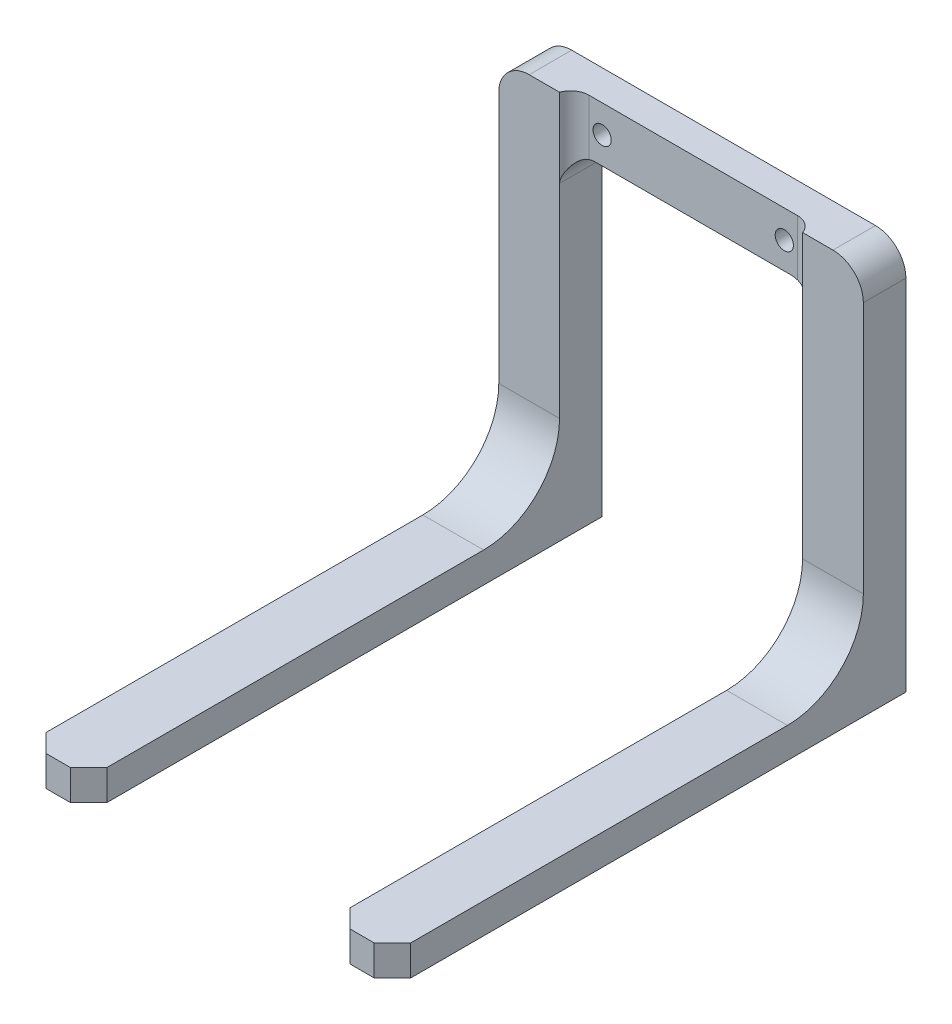
ISO-10303-21;
HEADER;
FILE_DESCRIPTION(('STEP AP214'),'2;1');
FILE_NAME('part.step','',(''),(''),'','','');
FILE_SCHEMA(('AUTOMOTIVE_DESIGN { 1 0 10303 214 1 1 1 1 }'));
ENDSEC;
DATA;
#1=APPLICATION_CONTEXT('core data for automotive mechanical design processes');
#2=APPLICATION_PROTOCOL_DEFINITION('international standard','automotive_design',2000,#1);
#3=PRODUCT_CONTEXT('',#1,'mechanical');
#4=PRODUCT('Part','Part','',(#3));
#5=PRODUCT_RELATED_PRODUCT_CATEGORY('part','',(#4));
#6=PRODUCT_DEFINITION_FORMATION('','',#4);
#7=PRODUCT_DEFINITION_CONTEXT('part definition',#1,'design');
#8=PRODUCT_DEFINITION('design','',#6,#7);
#9=PRODUCT_DEFINITION_SHAPE('','',#8);
#10=(LENGTH_UNIT() NAMED_UNIT(*) SI_UNIT(.MILLI.,.METRE.));
#11=(NAMED_UNIT(*) PLANE_ANGLE_UNIT() SI_UNIT($,.RADIAN.));
#12=(NAMED_UNIT(*) SI_UNIT($,.STERADIAN.) SOLID_ANGLE_UNIT());
#13=UNCERTAINTY_MEASURE_WITH_UNIT(LENGTH_MEASURE(1.E-05),#10,'distance_accuracy_value','');
#14=(GEOMETRIC_REPRESENTATION_CONTEXT(3) GLOBAL_UNCERTAINTY_ASSIGNED_CONTEXT((#13)) GLOBAL_UNIT_ASSIGNED_CONTEXT((#10,
#11,#12)) REPRESENTATION_CONTEXT('',''));
#15=CARTESIAN_POINT('',(0.,0.,0.));
#16=DIRECTION('',(0.,0.,1.));
#17=DIRECTION('',(1.,0.,0.));
#18=AXIS2_PLACEMENT_3D('',#15,#16,#17);
#19=CARTESIAN_POINT('',(-30.,9.,3.5));
#20=DIRECTION('',(0.,0.,-1.));
#21=DIRECTION('',(-1.,0.,0.));
#22=AXIS2_PLACEMENT_3D('',#19,#20,#21);
#23=PLANE('',#22);
#24=DIRECTION('',(0.,1.,0.));
#25=VECTOR('',#24,1.);
#26=CARTESIAN_POINT('',(20.,-55.,3.5));
#27=LINE('',#26,#25);
#28=CARTESIAN_POINT('',(20.,-37.5,3.5));
#29=VERTEX_POINT('',#28);
#30=CARTESIAN_POINT('',(20.,-4.,3.5));
#31=VERTEX_POINT('',#30);
#32=EDGE_CURVE('E245',#29,#31,#27,.T.);
#33=ORIENTED_EDGE('',*,*,#32,.F.);
#34=DIRECTION('',(-1.,0.,0.));
#35=VECTOR('',#34,1.);
#36=CARTESIAN_POINT('',(30.,-37.5,3.5));
#37=LINE('',#36,#35);
#38=CARTESIAN_POINT('',(30.,-37.5,3.5));
#39=VERTEX_POINT('',#38);
#40=EDGE_CURVE('E548',#29,#39,#37,.F.);
#41=ORIENTED_EDGE('',*,*,#40,.T.);
#42=DIRECTION('',(0.,-1.,0.));
#43=VECTOR('',#42,1.);
#44=CARTESIAN_POINT('',(30.,9.,3.5));
#45=LINE('',#44,#43);
#46=CARTESIAN_POINT('',(30.,4.,3.5));
#47=VERTEX_POINT('',#46);
#48=EDGE_CURVE('E279',#47,#39,#45,.T.);
#49=ORIENTED_EDGE('',*,*,#48,.F.);
#50=CARTESIAN_POINT('',(25.,4.,3.5));
#51=DIRECTION('',(0.,0.,-1.));
#52=DIRECTION('',(-1.,0.,0.));
#53=AXIS2_PLACEMENT_3D('',#50,#51,#52);
#54=CIRCLE('',#53,5.);
#55=CARTESIAN_POINT('',(25.,9.,3.5));
#56=VERTEX_POINT('',#55);
#57=EDGE_CURVE('E312',#47,#56,#54,.F.);
#58=ORIENTED_EDGE('',*,*,#57,.T.);
#59=DIRECTION('',(1.,0.,0.));
#60=VECTOR('',#59,1.);
#61=CARTESIAN_POINT('',(-30.,9.,3.5));
#62=LINE('',#61,#60);
#63=CARTESIAN_POINT('',(20.,9.,3.5));
#64=VERTEX_POINT('',#63);
#65=EDGE_CURVE('E276',#64,#56,#62,.T.);
#66=ORIENTED_EDGE('',*,*,#65,.F.);
#67=DIRECTION('',(0.,1.,0.));
#68=VECTOR('',#67,1.);
#69=CARTESIAN_POINT('',(20.,9.,3.5));
#70=LINE('',#69,#68);
#71=EDGE_CURVE('E265',#31,#64,#70,.T.);
#72=ORIENTED_EDGE('',*,*,#71,.F.);
#73=EDGE_LOOP('',(#33,#41,#49,#58,#66,#72));
#74=FACE_BOUND('',#73,.T.);
#75=ADVANCED_FACE('F48',(#74),#23,.F.);
#76=DIRECTION('',(0.,-1.,0.));
#77=VECTOR('',#76,1.);
#78=CARTESIAN_POINT('',(-30.,9.,3.5));
#79=LINE('',#78,#77);
#80=CARTESIAN_POINT('',(-30.,4.,3.5));
#81=VERTEX_POINT('',#80);
#82=CARTESIAN_POINT('',(-30.,-37.5,3.5));
#83=VERTEX_POINT('',#82);
#84=EDGE_CURVE('E284',#81,#83,#79,.T.);
#85=ORIENTED_EDGE('',*,*,#84,.T.);
#86=DIRECTION('',(-1.,0.,0.));
#87=VECTOR('',#86,1.);
#88=CARTESIAN_POINT('',(-20.,-37.5,3.5));
#89=LINE('',#88,#87);
#90=CARTESIAN_POINT('',(-20.,-37.5,3.5));
#91=VERTEX_POINT('',#90);
#92=EDGE_CURVE('E453',#83,#91,#89,.F.);
#93=ORIENTED_EDGE('',*,*,#92,.T.);
#94=DIRECTION('',(0.,1.,0.));
#95=VECTOR('',#94,1.);
#96=CARTESIAN_POINT('',(-20.,-55.,3.5));
#97=LINE('',#96,#95);
#98=CARTESIAN_POINT('',(-20.,-4.,3.5));
#99=VERTEX_POINT('',#98);
#100=EDGE_CURVE('E258',#91,#99,#97,.T.);
#101=ORIENTED_EDGE('',*,*,#100,.T.);
#102=DIRECTION('',(0.,-1.,0.));
#103=VECTOR('',#102,1.);
#104=CARTESIAN_POINT('',(-20.,9.,3.5));
#105=LINE('',#104,#103);
#106=CARTESIAN_POINT('',(-20.,9.,3.5));
#107=VERTEX_POINT('',#106);
#108=EDGE_CURVE('E260',#107,#99,#105,.T.);
#109=ORIENTED_EDGE('',*,*,#108,.F.);
#110=CARTESIAN_POINT('',(-25.,9.,3.5));
#111=VERTEX_POINT('',#110);
#112=EDGE_CURVE('E277',#111,#107,#62,.T.);
#113=ORIENTED_EDGE('',*,*,#112,.F.);
#114=CARTESIAN_POINT('',(-25.,4.,3.5));
#115=DIRECTION('',(0.,0.,-1.));
#116=DIRECTION('',(-1.,0.,0.));
#117=AXIS2_PLACEMENT_3D('',#114,#115,#116);
#118=CIRCLE('',#117,5.);
#119=EDGE_CURVE('E314',#111,#81,#118,.F.);
#120=ORIENTED_EDGE('',*,*,#119,.T.);
#121=EDGE_LOOP('',(#85,#93,#101,#109,#113,#120));
#122=FACE_BOUND('',#121,.T.);
#123=ADVANCED_FACE('F389',(#122),#23,.F.);
#124=CARTESIAN_POINT('',(0.,0.,0.));
#125=DIRECTION('',(0.,1.,0.));
#126=DIRECTION('',(0.,0.,1.));
#127=AXIS2_PLACEMENT_3D('',#124,#125,#126);
#128=PLANE('',#127);
#129=DIRECTION('',(-1.,0.,0.));
#130=VECTOR('',#129,1.);
#131=CARTESIAN_POINT('',(-30.,0.,-3.5));
#132=LINE('',#131,#130);
#133=CARTESIAN_POINT('',(16.,0.,-3.5));
#134=VERTEX_POINT('',#133);
#135=CARTESIAN_POINT('',(-16.,0.,-3.5));
#136=VERTEX_POINT('',#135);
#137=EDGE_CURVE('E268',#134,#136,#132,.T.);
#138=ORIENTED_EDGE('',*,*,#137,.F.);
#139=DIRECTION('',(0.,0.,-1.));
#140=VECTOR('',#139,1.);
#141=CARTESIAN_POINT('',(16.,0.,3.5));
#142=LINE('',#141,#140);
#143=CARTESIAN_POINT('',(16.,0.,1.5));
#144=VERTEX_POINT('',#143);
#145=EDGE_CURVE('E321',#134,#144,#142,.F.);
#146=ORIENTED_EDGE('',*,*,#145,.T.);
#147=DIRECTION('',(1.,0.,0.));
#148=VECTOR('',#147,1.);
#149=CARTESIAN_POINT('',(-20.,0.,1.5));
#150=LINE('',#149,#148);
#151=CARTESIAN_POINT('',(-16.,0.,1.5));
#152=VERTEX_POINT('',#151);
#153=EDGE_CURVE('E261',#152,#144,#150,.T.);
#154=ORIENTED_EDGE('',*,*,#153,.F.);
#155=DIRECTION('',(0.,0.,1.));
#156=VECTOR('',#155,1.);
#157=CARTESIAN_POINT('',(-16.,0.,-3.5));
#158=LINE('',#157,#156);
#159=EDGE_CURVE('E319',#152,#136,#158,.F.);
#160=ORIENTED_EDGE('',*,*,#159,.T.);
#161=EDGE_LOOP('',(#138,#146,#154,#160));
#162=FACE_BOUND('',#161,.T.);
#163=ADVANCED_FACE('F395',(#162),#128,.F.);
#164=CARTESIAN_POINT('',(30.,9.,-3.5));
#165=DIRECTION('',(-1.,0.,0.));
#166=DIRECTION('',(0.,0.,1.));
#167=AXIS2_PLACEMENT_3D('',#164,#165,#166);
#168=PLANE('',#167);
#169=DIRECTION('',(0.,0.,-1.));
#170=VECTOR('',#169,1.);
#171=CARTESIAN_POINT('',(30.,-50.,81.));
#172=LINE('',#171,#170);
#173=CARTESIAN_POINT('',(30.,-50.,78.));
#174=VERTEX_POINT('',#173);
#175=CARTESIAN_POINT('',(30.,-50.,16.));
#176=VERTEX_POINT('',#175);
#177=EDGE_CURVE('E520',#174,#176,#172,.T.);
#178=ORIENTED_EDGE('',*,*,#177,.F.);
#179=DIRECTION('',(0.,-1.,0.));
#180=VECTOR('',#179,1.);
#181=CARTESIAN_POINT('',(30.,9.,78.));
#182=LINE('',#181,#180);
#183=CARTESIAN_POINT('',(30.,-55.,78.));
#184=VERTEX_POINT('',#183);
#185=EDGE_CURVE('E479',#174,#184,#182,.T.);
#186=ORIENTED_EDGE('',*,*,#185,.T.);
#187=DIRECTION('',(0.,0.,1.));
#188=VECTOR('',#187,1.);
#189=CARTESIAN_POINT('',(30.,-55.,3.5));
#190=LINE('',#189,#188);
#191=CARTESIAN_POINT('',(30.,-55.,-3.5));
#192=VERTEX_POINT('',#191);
#193=EDGE_CURVE('E238',#192,#184,#190,.T.);
#194=ORIENTED_EDGE('',*,*,#193,.F.);
#195=DIRECTION('',(0.,-1.,0.));
#196=VECTOR('',#195,1.);
#197=CARTESIAN_POINT('',(30.,9.,-3.5));
#198=LINE('',#197,#196);
#199=CARTESIAN_POINT('',(30.,4.,-3.5));
#200=VERTEX_POINT('',#199);
#201=EDGE_CURVE('E237',#200,#192,#198,.T.);
#202=ORIENTED_EDGE('',*,*,#201,.F.);
#203=DIRECTION('',(0.,0.,-1.));
#204=VECTOR('',#203,1.);
#205=CARTESIAN_POINT('',(30.,4.,3.5));
#206=LINE('',#205,#204);
#207=EDGE_CURVE('E310',#200,#47,#206,.F.);
#208=ORIENTED_EDGE('',*,*,#207,.T.);
#209=ORIENTED_EDGE('',*,*,#48,.T.);
#210=CARTESIAN_POINT('',(30.,-37.5,16.));
#211=DIRECTION('',(-1.,0.,0.));
#212=DIRECTION('',(0.,0.,1.));
#213=AXIS2_PLACEMENT_3D('',#210,#211,#212);
#214=CIRCLE('',#213,12.5);
#215=EDGE_CURVE('E469',#39,#176,#214,.T.);
#216=ORIENTED_EDGE('',*,*,#215,.T.);
#217=EDGE_LOOP('',(#178,#186,#194,#202,#208,#209,#216));
#218=FACE_BOUND('',#217,.T.);
#219=ADVANCED_FACE('F408',(#218),#168,.F.);
#220=CARTESIAN_POINT('',(-30.,9.,-3.5));
#221=DIRECTION('',(0.,0.,1.));
#222=DIRECTION('',(1.,0.,0.));
#223=AXIS2_PLACEMENT_3D('',#220,#221,#222);
#224=PLANE('',#223);
#225=CARTESIAN_POINT('',(14.9914863383138,4.41229031516984,-3.5));
#226=DIRECTION('',(0.,0.,-1.));
#227=DIRECTION('',(-1.,0.,0.));
#228=AXIS2_PLACEMENT_3D('',#225,#226,#227);
#229=CIRCLE('',#228,1.5);
#230=CARTESIAN_POINT('',(13.4914863383138,4.41229031516984,-3.5));
#231=VERTEX_POINT('',#230);
#232=EDGE_CURVE('E500',#231,#231,#229,.T.);
#233=ORIENTED_EDGE('',*,*,#232,.F.);
#234=EDGE_LOOP('',(#233));
#235=FACE_BOUND('',#234,.T.);
#236=CARTESIAN_POINT('',(-14.9914863383138,4.41229031516984,-3.5));
#237=DIRECTION('',(0.,0.,-1.));
#238=DIRECTION('',(-1.,0.,0.));
#239=AXIS2_PLACEMENT_3D('',#236,#237,#238);
#240=CIRCLE('',#239,1.5);
#241=CARTESIAN_POINT('',(-16.4914863383138,4.41229031516984,-3.5));
#242=VERTEX_POINT('',#241);
#243=EDGE_CURVE('E506',#242,#242,#240,.T.);
#244=ORIENTED_EDGE('',*,*,#243,.F.);
#245=EDGE_LOOP('',(#244));
#246=FACE_BOUND('',#245,.T.);
#247=DIRECTION('',(-1.,0.,0.));
#248=VECTOR('',#247,1.);
#249=CARTESIAN_POINT('',(-30.,9.,-3.5));
#250=LINE('',#249,#248);
#251=CARTESIAN_POINT('',(25.,9.,-3.5));
#252=VERTEX_POINT('',#251);
#253=CARTESIAN_POINT('',(-25.,9.,-3.5));
#254=VERTEX_POINT('',#253);
#255=EDGE_CURVE('E273',#252,#254,#250,.T.);
#256=ORIENTED_EDGE('',*,*,#255,.F.);
#257=CARTESIAN_POINT('',(25.,4.,-3.5));
#258=DIRECTION('',(0.,0.,1.));
#259=DIRECTION('',(1.,0.,0.));
#260=AXIS2_PLACEMENT_3D('',#257,#258,#259);
#261=CIRCLE('',#260,5.);
#262=EDGE_CURVE('E308',#252,#200,#261,.F.);
#263=ORIENTED_EDGE('',*,*,#262,.T.);
#264=ORIENTED_EDGE('',*,*,#201,.T.);
#265=DIRECTION('',(1.,0.,0.));
#266=VECTOR('',#265,1.);
#267=CARTESIAN_POINT('',(20.,-55.,-3.5));
#268=LINE('',#267,#266);
#269=CARTESIAN_POINT('',(20.,-55.,-3.5));
#270=VERTEX_POINT('',#269);
#271=EDGE_CURVE('E222',#270,#192,#268,.T.);
#272=ORIENTED_EDGE('',*,*,#271,.F.);
#273=DIRECTION('',(0.,1.,0.));
#274=VECTOR('',#273,1.);
#275=CARTESIAN_POINT('',(20.,-55.,-3.5));
#276=LINE('',#275,#274);
#277=CARTESIAN_POINT('',(20.,-4.,-3.5));
#278=VERTEX_POINT('',#277);
#279=EDGE_CURVE('E235',#270,#278,#276,.T.);
#280=ORIENTED_EDGE('',*,*,#279,.T.);
#281=CARTESIAN_POINT('',(16.,-4.,-3.5));
#282=DIRECTION('',(0.,0.,1.));
#283=DIRECTION('',(1.,0.,0.));
#284=AXIS2_PLACEMENT_3D('',#281,#282,#283);
#285=CIRCLE('',#284,4.);
#286=EDGE_CURVE('E326',#278,#134,#285,.T.);
#287=ORIENTED_EDGE('',*,*,#286,.T.);
#288=ORIENTED_EDGE('',*,*,#137,.T.);
#289=CARTESIAN_POINT('',(-16.,-4.,-3.5));
#290=DIRECTION('',(0.,0.,1.));
#291=DIRECTION('',(1.,0.,0.));
#292=AXIS2_PLACEMENT_3D('',#289,#290,#291);
#293=CIRCLE('',#292,4.);
#294=CARTESIAN_POINT('',(-20.,-4.,-3.5));
#295=VERTEX_POINT('',#294);
#296=EDGE_CURVE('E551',#136,#295,#293,.T.);
#297=ORIENTED_EDGE('',*,*,#296,.T.);
#298=DIRECTION('',(0.,1.,0.));
#299=VECTOR('',#298,1.);
#300=CARTESIAN_POINT('',(-20.,-55.,-3.5));
#301=LINE('',#300,#299);
#302=CARTESIAN_POINT('',(-20.,-55.,-3.5));
#303=VERTEX_POINT('',#302);
#304=EDGE_CURVE('E255',#303,#295,#301,.T.);
#305=ORIENTED_EDGE('',*,*,#304,.F.);
#306=DIRECTION('',(1.,0.,0.));
#307=VECTOR('',#306,1.);
#308=CARTESIAN_POINT('',(-20.,-55.,-3.5));
#309=LINE('',#308,#307);
#310=CARTESIAN_POINT('',(-30.,-55.,-3.5));
#311=VERTEX_POINT('',#310);
#312=EDGE_CURVE('E253',#311,#303,#309,.T.);
#313=ORIENTED_EDGE('',*,*,#312,.F.);
#314=DIRECTION('',(0.,-1.,0.));
#315=VECTOR('',#314,1.);
#316=CARTESIAN_POINT('',(-30.,9.,-3.5));
#317=LINE('',#316,#315);
#318=CARTESIAN_POINT('',(-30.,4.,-3.5));
#319=VERTEX_POINT('',#318);
#320=EDGE_CURVE('E287',#319,#311,#317,.T.);
#321=ORIENTED_EDGE('',*,*,#320,.F.);
#322=CARTESIAN_POINT('',(-25.,4.,-3.5));
#323=DIRECTION('',(0.,0.,1.));
#324=DIRECTION('',(1.,0.,0.));
#325=AXIS2_PLACEMENT_3D('',#322,#323,#324);
#326=CIRCLE('',#325,5.);
#327=EDGE_CURVE('E306',#319,#254,#326,.F.);
#328=ORIENTED_EDGE('',*,*,#327,.T.);
#329=EDGE_LOOP('',(#256,#263,#264,#272,#280,#287,#288,#297,#305,#313,#321,#328));
#330=FACE_BOUND('',#329,.T.);
#331=ADVANCED_FACE('F234',(#235,#246,#330),#224,.F.);
#332=CARTESIAN_POINT('',(-30.,9.,-3.5));
#333=DIRECTION('',(1.,0.,0.));
#334=DIRECTION('',(0.,0.,-1.));
#335=AXIS2_PLACEMENT_3D('',#332,#333,#334);
#336=PLANE('',#335);
#337=DIRECTION('',(0.,0.,-1.));
#338=VECTOR('',#337,1.);
#339=CARTESIAN_POINT('',(-30.,-55.,3.5));
#340=LINE('',#339,#338);
#341=CARTESIAN_POINT('',(-30.,-55.,78.));
#342=VERTEX_POINT('',#341);
#343=EDGE_CURVE('E247',#342,#311,#340,.T.);
#344=ORIENTED_EDGE('',*,*,#343,.F.);
#345=DIRECTION('',(0.,1.,0.));
#346=VECTOR('',#345,1.);
#347=CARTESIAN_POINT('',(-30.,9.,78.));
#348=LINE('',#347,#346);
#349=CARTESIAN_POINT('',(-30.,-50.,78.));
#350=VERTEX_POINT('',#349);
#351=EDGE_CURVE('E13',#342,#350,#348,.T.);
#352=ORIENTED_EDGE('',*,*,#351,.T.);
#353=DIRECTION('',(0.,0.,-1.));
#354=VECTOR('',#353,1.);
#355=CARTESIAN_POINT('',(-30.,-50.,81.));
#356=LINE('',#355,#354);
#357=CARTESIAN_POINT('',(-30.,-50.,16.));
#358=VERTEX_POINT('',#357);
#359=EDGE_CURVE('E528',#350,#358,#356,.T.);
#360=ORIENTED_EDGE('',*,*,#359,.T.);
#361=CARTESIAN_POINT('',(-30.,-37.5,16.));
#362=DIRECTION('',(1.,0.,0.));
#363=DIRECTION('',(0.,0.,-1.));
#364=AXIS2_PLACEMENT_3D('',#361,#362,#363);
#365=CIRCLE('',#364,12.5);
#366=EDGE_CURVE('E464',#358,#83,#365,.T.);
#367=ORIENTED_EDGE('',*,*,#366,.T.);
#368=ORIENTED_EDGE('',*,*,#84,.F.);
#369=DIRECTION('',(0.,0.,1.));
#370=VECTOR('',#369,1.);
#371=CARTESIAN_POINT('',(-30.,4.,-3.5));
#372=LINE('',#371,#370);
#373=EDGE_CURVE('E316',#81,#319,#372,.F.);
#374=ORIENTED_EDGE('',*,*,#373,.T.);
#375=ORIENTED_EDGE('',*,*,#320,.T.);
#376=EDGE_LOOP('',(#344,#352,#360,#367,#368,#374,#375));
#377=FACE_BOUND('',#376,.T.);
#378=ADVANCED_FACE('F401',(#377),#336,.F.);
#379=CARTESIAN_POINT('',(0.,9.,0.));
#380=DIRECTION('',(0.,1.,0.));
#381=DIRECTION('',(0.,0.,1.));
#382=AXIS2_PLACEMENT_3D('',#379,#380,#381);
#383=PLANE('',#382);
#384=ORIENTED_EDGE('',*,*,#65,.T.);
#385=DIRECTION('',(0.,0.,-1.));
#386=VECTOR('',#385,1.);
#387=CARTESIAN_POINT('',(25.,9.,-3.5));
#388=LINE('',#387,#386);
#389=EDGE_CURVE('E303',#56,#252,#388,.T.);
#390=ORIENTED_EDGE('',*,*,#389,.T.);
#391=ORIENTED_EDGE('',*,*,#255,.T.);
#392=DIRECTION('',(0.,0.,1.));
#393=VECTOR('',#392,1.);
#394=CARTESIAN_POINT('',(-25.,9.,3.5));
#395=LINE('',#394,#393);
#396=EDGE_CURVE('E300',#254,#111,#395,.T.);
#397=ORIENTED_EDGE('',*,*,#396,.T.);
#398=ORIENTED_EDGE('',*,*,#112,.T.);
#399=CARTESIAN_POINT('',(-17.1715728752538,9.,4.5));
#400=DIRECTION('',(0.,1.,0.));
#401=DIRECTION('',(0.,0.,1.));
#402=AXIS2_PLACEMENT_3D('',#399,#400,#401);
#403=CIRCLE('',#402,3.);
#404=CARTESIAN_POINT('',(-17.1715728752538,9.,1.5));
#405=VERTEX_POINT('',#404);
#406=EDGE_CURVE('E296',#107,#405,#403,.F.);
#407=ORIENTED_EDGE('',*,*,#406,.T.);
#408=DIRECTION('',(-1.,0.,0.));
#409=VECTOR('',#408,1.);
#410=CARTESIAN_POINT('',(-20.,9.,1.5));
#411=LINE('',#410,#409);
#412=CARTESIAN_POINT('',(17.1715728752538,9.,1.5));
#413=VERTEX_POINT('',#412);
#414=EDGE_CURVE('E264',#413,#405,#411,.T.);
#415=ORIENTED_EDGE('',*,*,#414,.F.);
#416=CARTESIAN_POINT('',(17.1715728752538,9.,4.5));
#417=DIRECTION('',(0.,1.,0.));
#418=DIRECTION('',(0.,0.,1.));
#419=AXIS2_PLACEMENT_3D('',#416,#417,#418);
#420=CIRCLE('',#419,3.);
#421=EDGE_CURVE('E298',#413,#64,#420,.F.);
#422=ORIENTED_EDGE('',*,*,#421,.T.);
#423=EDGE_LOOP('',(#384,#390,#391,#397,#398,#407,#415,#422));
#424=FACE_BOUND('',#423,.T.);
#425=ADVANCED_FACE('F404',(#424),#383,.T.);
#426=CARTESIAN_POINT('',(0.,0.,1.5));
#427=DIRECTION('',(0.,0.,1.));
#428=DIRECTION('',(1.,0.,0.));
#429=AXIS2_PLACEMENT_3D('',#426,#427,#428);
#430=PLANE('',#429);
#431=CARTESIAN_POINT('',(14.9914863383138,4.41229031516984,1.5));
#432=DIRECTION('',(0.,0.,1.));
#433=DIRECTION('',(1.,0.,0.));
#434=AXIS2_PLACEMENT_3D('',#431,#432,#433);
#435=CIRCLE('',#434,1.5);
#436=CARTESIAN_POINT('',(16.4914863383138,4.41229031516984,1.5));
#437=VERTEX_POINT('',#436);
#438=EDGE_CURVE('E52',#437,#437,#435,.T.);
#439=ORIENTED_EDGE('',*,*,#438,.F.);
#440=EDGE_LOOP('',(#439));
#441=FACE_BOUND('',#440,.T.);
#442=CARTESIAN_POINT('',(-14.9914863383138,4.41229031516984,1.5));
#443=DIRECTION('',(0.,0.,1.));
#444=DIRECTION('',(1.,0.,0.));
#445=AXIS2_PLACEMENT_3D('',#442,#443,#444);
#446=CIRCLE('',#445,1.5);
#447=CARTESIAN_POINT('',(-13.4914863383138,4.41229031516984,1.5));
#448=VERTEX_POINT('',#447);
#449=EDGE_CURVE('E498',#448,#448,#446,.T.);
#450=ORIENTED_EDGE('',*,*,#449,.F.);
#451=EDGE_LOOP('',(#450));
#452=FACE_BOUND('',#451,.T.);
#453=ORIENTED_EDGE('',*,*,#414,.T.);
#454=DIRECTION('',(0.,1.,0.));
#455=VECTOR('',#454,1.);
#456=CARTESIAN_POINT('',(-17.1715728752538,0.,1.5));
#457=LINE('',#456,#455);
#458=CARTESIAN_POINT('',(-17.1715728752538,-0.175419369660306,1.5));
#459=VERTEX_POINT('',#458);
#460=EDGE_CURVE('E294',#405,#459,#457,.F.);
#461=ORIENTED_EDGE('',*,*,#460,.T.);
#462=CARTESIAN_POINT('',(-16.,-4.,1.5));
#463=DIRECTION('',(0.,0.,1.));
#464=DIRECTION('',(1.,0.,0.));
#465=AXIS2_PLACEMENT_3D('',#462,#463,#464);
#466=CIRCLE('',#465,4.);
#467=EDGE_CURVE('E554',#459,#152,#466,.F.);
#468=ORIENTED_EDGE('',*,*,#467,.T.);
#469=ORIENTED_EDGE('',*,*,#153,.T.);
#470=CARTESIAN_POINT('',(16.,-4.,1.5));
#471=DIRECTION('',(0.,0.,1.));
#472=DIRECTION('',(1.,0.,0.));
#473=AXIS2_PLACEMENT_3D('',#470,#471,#472);
#474=CIRCLE('',#473,4.);
#475=CARTESIAN_POINT('',(17.1715728752538,-0.175419369660305,1.5));
#476=VERTEX_POINT('',#475);
#477=EDGE_CURVE('E328',#144,#476,#474,.F.);
#478=ORIENTED_EDGE('',*,*,#477,.T.);
#479=DIRECTION('',(0.,-1.,0.));
#480=VECTOR('',#479,1.);
#481=CARTESIAN_POINT('',(17.1715728752538,9.,1.5));
#482=LINE('',#481,#480);
#483=EDGE_CURVE('E291',#476,#413,#482,.F.);
#484=ORIENTED_EDGE('',*,*,#483,.T.);
#485=EDGE_LOOP('',(#453,#461,#468,#469,#478,#484));
#486=FACE_BOUND('',#485,.T.);
#487=ADVANCED_FACE('F415',(#441,#452,#486),#430,.T.);
#488=CARTESIAN_POINT('',(-17.1715728752538,9.,4.5));
#489=DIRECTION('',(0.,-1.,0.));
#490=DIRECTION('',(0.,0.,-1.));
#491=AXIS2_PLACEMENT_3D('',#488,#489,#490);
#492=CYLINDRICAL_SURFACE('',#491,3.);
#493=ORIENTED_EDGE('',*,*,#406,.F.);
#494=ORIENTED_EDGE('',*,*,#108,.T.);
#495=CARTESIAN_POINT('',(-20.,-4.,3.5));
#496=CARTESIAN_POINT('',(-20.0000125172672,-3.94890423966606,3.50007867382474));
#497=CARTESIAN_POINT('',(-19.9990216171283,-3.89787219673648,3.49723123887229));
#498=CARTESIAN_POINT('',(-19.9951437107142,-3.79664296568642,3.48634183352001));
#499=CARTESIAN_POINT('',(-19.9922646096988,-3.74644318764319,3.47832152251453));
#500=CARTESIAN_POINT('',(-19.9847931730004,-3.64812337707943,3.45793537448314));
#501=CARTESIAN_POINT('',(-19.9802354410995,-3.59998187139829,3.44565758248557));
#502=CARTESIAN_POINT('',(-19.9695279771533,-3.5048859637406,3.41756017926966));
#503=CARTESIAN_POINT('',(-19.9633763969301,-3.45793300981883,3.40173645919838));
#504=CARTESIAN_POINT('',(-19.9445430737231,-3.33128310366102,3.35472422483758));
#505=CARTESIAN_POINT('',(-19.9303815309757,-3.25283577692916,3.32078036701804));
#506=CARTESIAN_POINT('',(-19.8980468531149,-3.09922337385732,3.24782611475226));
#507=CARTESIAN_POINT('',(-19.8798707356597,-3.02406078766757,3.20881196260823));
#508=CARTESIAN_POINT('',(-19.8394550345246,-2.87546055354648,3.1272269282467));
#509=CARTESIAN_POINT('',(-19.8171645668805,-2.80205920008103,3.08461560401368));
#510=CARTESIAN_POINT('',(-19.7687756983967,-2.65756478477282,2.99766170485277));
#511=CARTESIAN_POINT('',(-19.7426761583598,-2.58647242129426,2.95331861491361));
#512=CARTESIAN_POINT('',(-19.6672424085954,-2.39759117697847,2.83278315717427));
#513=CARTESIAN_POINT('',(-19.614361222708,-2.28166517784151,2.75586154560395));
#514=CARTESIAN_POINT('',(-19.4975291311022,-2.05486439391033,2.60283718375395));
#515=CARTESIAN_POINT('',(-19.4335717616198,-1.94399260661187,2.52673493933424));
#516=CARTESIAN_POINT('',(-19.2946047093908,-1.72800070817395,2.37796216012691));
#517=CARTESIAN_POINT('',(-19.2196538093976,-1.62285385078055,2.30527593270951));
#518=CARTESIAN_POINT('',(-19.0581311355653,-1.41837450648789,2.16497634666987));
#519=CARTESIAN_POINT('',(-18.9715676348955,-1.31903795184599,2.09735942949252));
#520=CARTESIAN_POINT('',(-18.7613277019077,-1.10106752988892,1.9518288882481));
#521=CARTESIAN_POINT('',(-18.6339498418783,-0.984495471204347,1.87608766246497));
#522=CARTESIAN_POINT('',(-18.3599512538888,-0.765628297290269,1.74120885379916));
#523=CARTESIAN_POINT('',(-18.2133937487442,-0.663288459369911,1.68201864063746));
#524=CARTESIAN_POINT('',(-17.9903673525854,-0.529452915053361,1.61302779863489));
#525=CARTESIAN_POINT('',(-17.9210006040936,-0.490560989866943,1.59420194413775));
#526=CARTESIAN_POINT('',(-17.7791904363639,-0.416584417590021,1.5612768534233));
#527=CARTESIAN_POINT('',(-17.7067482422311,-0.381498273902095,1.54717575463784));
#528=CARTESIAN_POINT('',(-17.5584765871954,-0.315193763898853,1.52410005428315));
#529=CARTESIAN_POINT('',(-17.4826217579957,-0.284014696392011,1.51517469895951));
#530=CARTESIAN_POINT('',(-17.3286369446797,-0.226203956401213,1.50311397895616));
#531=CARTESIAN_POINT('',(-17.2505039887708,-0.199578566099136,1.49998655544725));
#532=CARTESIAN_POINT('',(-17.1715728752538,-0.175419369660308,1.5));
#533=B_SPLINE_CURVE_WITH_KNOTS('',3,(#495,#496,#497,#498,#499,#500,#501,#502,#503,#504,#505,
#506,#507,#508,#509,#510,#511,#512,#513,#514,#515,#516,#517,#518,#519,#520,#521,#522,#523,#524,
#525,#526,#527,#528,#529,#530,#531,#532),.UNSPECIFIED.,.F.,.F.,(4,2,2,2,2,2,2,2,2,2,2,2,2,2,2,2,
2,2,4),(0.,0.153096926409289,0.305556944657195,0.455035564188024,0.604688296411025,
0.864134554185803,1.12377420120096,1.38687104740197,1.65004674107332,2.09601623300166,
2.5422468632096,2.98617304174798,3.42978461694371,3.99356360010604,4.55552889884545,
4.80047045679019,5.04531534125343,5.29245319294226,5.53992928904981),.UNSPECIFIED.);
#534=EDGE_CURVE('E340',#99,#459,#533,.T.);
#535=ORIENTED_EDGE('',*,*,#534,.T.);
#536=ORIENTED_EDGE('',*,*,#460,.F.);
#537=EDGE_LOOP('',(#493,#494,#535,#536));
#538=FACE_BOUND('',#537,.T.);
#539=ADVANCED_FACE('F412',(#538),#492,.F.);
#540=CARTESIAN_POINT('',(17.1715728752538,9.,4.5));
#541=DIRECTION('',(0.,1.,0.));
#542=DIRECTION('',(0.,0.,1.));
#543=AXIS2_PLACEMENT_3D('',#540,#541,#542);
#544=CYLINDRICAL_SURFACE('',#543,3.);
#545=ORIENTED_EDGE('',*,*,#483,.F.);
#546=CARTESIAN_POINT('',(17.1715728752538,-0.175419369660305,1.5));
#547=CARTESIAN_POINT('',(17.2522919108185,-0.200124446777149,1.49998540504215));
#548=CARTESIAN_POINT('',(17.3321739729097,-0.227409727152059,1.5032565629508));
#549=CARTESIAN_POINT('',(17.4895406598214,-0.286741846294445,1.51585956350559));
#550=CARTESIAN_POINT('',(17.5670284174486,-0.318782114403804,1.52518310175429));
#551=CARTESIAN_POINT('',(17.7183718661869,-0.386963613317481,1.54926571716145));
#552=CARTESIAN_POINT('',(17.7922554403629,-0.42306217676563,1.56397134298444));
#553=CARTESIAN_POINT('',(17.9367815212361,-0.499206312119627,1.59828032781496));
#554=CARTESIAN_POINT('',(18.0074229638663,-0.539253166468878,1.61788528136631));
#555=CARTESIAN_POINT('',(18.2132299210952,-0.664248766087553,1.68298863133375));
#556=CARTESIAN_POINT('',(18.3432240528672,-0.754485066939347,1.7349384889071));
#557=CARTESIAN_POINT('',(18.5882959261165,-0.946299794262506,1.8520845690521));
#558=CARTESIAN_POINT('',(18.7033274575593,-1.04791163510269,1.91732030284656));
#559=CARTESIAN_POINT('',(18.982021767921,-1.32315897497439,2.09916446291514));
#560=CARTESIAN_POINT('',(19.134034061349,-1.50375175638,2.2232855301071));
#561=CARTESIAN_POINT('',(19.3342318165327,-1.78723408443104,2.4187363339481));
#562=CARTESIAN_POINT('',(19.3963882982851,-1.88395684688158,2.48552145229454));
#563=CARTESIAN_POINT('',(19.5117489866454,-2.08148750663202,2.62078463001524));
#564=CARTESIAN_POINT('',(19.5649565245898,-2.18229386635297,2.68926204847701));
#565=CARTESIAN_POINT('',(19.6482237869499,-2.35777041489577,2.8059739519584));
#566=CARTESIAN_POINT('',(19.6804862623243,-2.4313964617692,2.8542319547266));
#567=CARTESIAN_POINT('',(19.7406878474535,-2.58093306818484,2.9498913272683));
#568=CARTESIAN_POINT('',(19.7686276443082,-2.65684326236045,2.99729283212404));
#569=CARTESIAN_POINT('',(19.8201524816792,-2.81127676500627,3.09009322094868));
#570=CARTESIAN_POINT('',(19.8437397581805,-2.88979870715643,3.13549312400955));
#571=CARTESIAN_POINT('',(19.886439960422,-3.05002617248687,3.22256345667645));
#572=CARTESIAN_POINT('',(19.90555622495,-3.13172926657005,3.26423665479209));
#573=CARTESIAN_POINT('',(19.9400965501745,-3.30437687226671,3.34360501490337));
#574=CARTESIAN_POINT('',(19.95521352332,-3.39557955010445,3.38088626737302));
#575=CARTESIAN_POINT('',(19.9792747019083,-3.5827071493096,3.44267423188358));
#576=CARTESIAN_POINT('',(19.9882596142488,-3.67859630972074,3.46726491726658));
#577=CARTESIAN_POINT('',(19.9957988331695,-3.8130070823454,3.48817848351843));
#578=CARTESIAN_POINT('',(19.9973651570008,-3.85013825378379,3.4925711278243));
#579=CARTESIAN_POINT('',(19.9994694906118,-3.92483802033579,3.49849835945676));
#580=CARTESIAN_POINT('',(20.0000024266962,-3.96240786711893,3.50001884420594));
#581=CARTESIAN_POINT('',(20.,-4.,3.5));
#582=B_SPLINE_CURVE_WITH_KNOTS('',3,(#546,#547,#548,#549,#550,#551,#552,#553,#554,#555,#556,
#557,#558,#559,#560,#561,#562,#563,#564,#565,#566,#567,#568,#569,#570,#571,#572,#573,#574,#575,
#576,#577,#578,#579,#580,#581),.UNSPECIFIED.,.F.,.F.,(4,2,2,2,2,2,2,2,2,2,2,2,2,2,2,2,2,4),(0.,
0.253071871520941,0.50579723806022,0.756077947453127,1.00644021997404,1.50404344771215,
2.00314870629897,2.79843980779802,3.1970908388133,3.59559313782901,3.87675709228644,
4.15787630905648,4.43885070421056,4.71961460323953,5.01800244121171,5.31438968347081,
5.42654345033749,5.53924648577563),.UNSPECIFIED.);
#583=EDGE_CURVE('E331',#476,#31,#582,.T.);
#584=ORIENTED_EDGE('',*,*,#583,.T.);
#585=ORIENTED_EDGE('',*,*,#71,.T.);
#586=ORIENTED_EDGE('',*,*,#421,.F.);
#587=EDGE_LOOP('',(#545,#584,#585,#586));
#588=FACE_BOUND('',#587,.T.);
#589=ADVANCED_FACE('F348',(#588),#544,.F.);
#590=CARTESIAN_POINT('',(25.,4.,0.));
#591=DIRECTION('',(0.,0.,1.));
#592=DIRECTION('',(1.,0.,0.));
#593=AXIS2_PLACEMENT_3D('',#590,#591,#592);
#594=CYLINDRICAL_SURFACE('',#593,5.);
#595=ORIENTED_EDGE('',*,*,#57,.F.);
#596=ORIENTED_EDGE('',*,*,#207,.F.);
#597=ORIENTED_EDGE('',*,*,#262,.F.);
#598=ORIENTED_EDGE('',*,*,#389,.F.);
#599=EDGE_LOOP('',(#595,#596,#597,#598));
#600=FACE_BOUND('',#599,.T.);
#601=ADVANCED_FACE('F421',(#600),#594,.T.);
#602=CARTESIAN_POINT('',(-25.,4.,0.));
#603=DIRECTION('',(0.,0.,-1.));
#604=DIRECTION('',(-1.,0.,0.));
#605=AXIS2_PLACEMENT_3D('',#602,#603,#604);
#606=CYLINDRICAL_SURFACE('',#605,5.);
#607=ORIENTED_EDGE('',*,*,#327,.F.);
#608=ORIENTED_EDGE('',*,*,#373,.F.);
#609=ORIENTED_EDGE('',*,*,#119,.F.);
#610=ORIENTED_EDGE('',*,*,#396,.F.);
#611=EDGE_LOOP('',(#607,#608,#609,#610));
#612=FACE_BOUND('',#611,.T.);
#613=ADVANCED_FACE('F357',(#612),#606,.T.);
#614=CARTESIAN_POINT('',(-20.,-55.,3.5));
#615=DIRECTION('',(-1.,0.,0.));
#616=DIRECTION('',(0.,0.,1.));
#617=AXIS2_PLACEMENT_3D('',#614,#615,#616);
#618=PLANE('',#617);
#619=DIRECTION('',(0.,0.,-1.));
#620=VECTOR('',#619,1.);
#621=CARTESIAN_POINT('',(-20.,-50.,81.));
#622=LINE('',#621,#620);
#623=CARTESIAN_POINT('',(-20.,-50.,78.));
#624=VERTEX_POINT('',#623);
#625=CARTESIAN_POINT('',(-20.,-50.,16.));
#626=VERTEX_POINT('',#625);
#627=EDGE_CURVE('E229',#624,#626,#622,.T.);
#628=ORIENTED_EDGE('',*,*,#627,.F.);
#629=DIRECTION('',(0.,-1.,0.));
#630=VECTOR('',#629,1.);
#631=CARTESIAN_POINT('',(-20.,-55.,78.));
#632=LINE('',#631,#630);
#633=CARTESIAN_POINT('',(-20.,-55.,78.));
#634=VERTEX_POINT('',#633);
#635=EDGE_CURVE('E73',#624,#634,#632,.T.);
#636=ORIENTED_EDGE('',*,*,#635,.T.);
#637=DIRECTION('',(0.,0.,1.));
#638=VECTOR('',#637,1.);
#639=CARTESIAN_POINT('',(-20.,-55.,3.5));
#640=LINE('',#639,#638);
#641=EDGE_CURVE('E244',#303,#634,#640,.T.);
#642=ORIENTED_EDGE('',*,*,#641,.F.);
#643=ORIENTED_EDGE('',*,*,#304,.T.);
#644=DIRECTION('',(0.,0.,1.));
#645=VECTOR('',#644,1.);
#646=CARTESIAN_POINT('',(-20.,-4.,3.5));
#647=LINE('',#646,#645);
#648=EDGE_CURVE('E323',#295,#99,#647,.T.);
#649=ORIENTED_EDGE('',*,*,#648,.T.);
#650=ORIENTED_EDGE('',*,*,#100,.F.);
#651=CARTESIAN_POINT('',(-20.,-37.5,16.));
#652=DIRECTION('',(-1.,0.,0.));
#653=DIRECTION('',(0.,0.,1.));
#654=AXIS2_PLACEMENT_3D('',#651,#652,#653);
#655=CIRCLE('',#654,12.5);
#656=EDGE_CURVE('E457',#91,#626,#655,.T.);
#657=ORIENTED_EDGE('',*,*,#656,.T.);
#658=EDGE_LOOP('',(#628,#636,#642,#643,#649,#650,#657));
#659=FACE_BOUND('',#658,.T.);
#660=ADVANCED_FACE('F456',(#659),#618,.F.);
#661=CARTESIAN_POINT('',(0.,-55.,0.));
#662=DIRECTION('',(0.,1.,0.));
#663=DIRECTION('',(0.,0.,1.));
#664=AXIS2_PLACEMENT_3D('',#661,#662,#663);
#665=PLANE('',#664);
#666=ORIENTED_EDGE('',*,*,#641,.T.);
#667=DIRECTION('',(0.707106781186546,0.,-0.707106781186549));
#668=VECTOR('',#667,1.);
#669=CARTESIAN_POINT('',(-23.,-55.,81.));
#670=LINE('',#669,#668);
#671=CARTESIAN_POINT('',(-23.,-55.,81.));
#672=VERTEX_POINT('',#671);
#673=EDGE_CURVE('E57',#634,#672,#670,.F.);
#674=ORIENTED_EDGE('',*,*,#673,.T.);
#675=DIRECTION('',(1.,0.,0.));
#676=VECTOR('',#675,1.);
#677=CARTESIAN_POINT('',(-30.,-55.,81.));
#678=LINE('',#677,#676);
#679=CARTESIAN_POINT('',(-27.,-55.,81.));
#680=VERTEX_POINT('',#679);
#681=EDGE_CURVE('E522',#680,#672,#678,.T.);
#682=ORIENTED_EDGE('',*,*,#681,.F.);
#683=DIRECTION('',(0.707106781186544,0.,0.707106781186551));
#684=VECTOR('',#683,1.);
#685=CARTESIAN_POINT('',(-27.,-55.,81.));
#686=LINE('',#685,#684);
#687=EDGE_CURVE('E65',#680,#342,#686,.F.);
#688=ORIENTED_EDGE('',*,*,#687,.T.);
#689=ORIENTED_EDGE('',*,*,#343,.T.);
#690=ORIENTED_EDGE('',*,*,#312,.T.);
#691=EDGE_LOOP('',(#666,#674,#682,#688,#689,#690));
#692=FACE_BOUND('',#691,.T.);
#693=ADVANCED_FACE('F563',(#692),#665,.F.);
#694=CARTESIAN_POINT('',(20.,-55.,3.5));
#695=DIRECTION('',(1.,0.,0.));
#696=DIRECTION('',(0.,0.,-1.));
#697=AXIS2_PLACEMENT_3D('',#694,#695,#696);
#698=PLANE('',#697);
#699=DIRECTION('',(0.,0.,-1.));
#700=VECTOR('',#699,1.);
#701=CARTESIAN_POINT('',(20.,-55.,3.5));
#702=LINE('',#701,#700);
#703=CARTESIAN_POINT('',(20.,-55.,78.));
#704=VERTEX_POINT('',#703);
#705=EDGE_CURVE('E218',#704,#270,#702,.T.);
#706=ORIENTED_EDGE('',*,*,#705,.F.);
#707=DIRECTION('',(0.,1.,0.));
#708=VECTOR('',#707,1.);
#709=CARTESIAN_POINT('',(20.,-55.,78.));
#710=LINE('',#709,#708);
#711=CARTESIAN_POINT('',(20.,-50.,78.));
#712=VERTEX_POINT('',#711);
#713=EDGE_CURVE('E484',#704,#712,#710,.T.);
#714=ORIENTED_EDGE('',*,*,#713,.T.);
#715=DIRECTION('',(0.,0.,-1.));
#716=VECTOR('',#715,1.);
#717=CARTESIAN_POINT('',(20.,-50.,81.));
#718=LINE('',#717,#716);
#719=CARTESIAN_POINT('',(20.,-50.,16.));
#720=VERTEX_POINT('',#719);
#721=EDGE_CURVE('E518',#712,#720,#718,.T.);
#722=ORIENTED_EDGE('',*,*,#721,.T.);
#723=CARTESIAN_POINT('',(20.,-37.5,16.));
#724=DIRECTION('',(1.,0.,0.));
#725=DIRECTION('',(0.,0.,-1.));
#726=AXIS2_PLACEMENT_3D('',#723,#724,#725);
#727=CIRCLE('',#726,12.5);
#728=EDGE_CURVE('E543',#720,#29,#727,.T.);
#729=ORIENTED_EDGE('',*,*,#728,.T.);
#730=ORIENTED_EDGE('',*,*,#32,.T.);
#731=DIRECTION('',(0.,0.,-1.));
#732=VECTOR('',#731,1.);
#733=CARTESIAN_POINT('',(20.,-4.,-3.5));
#734=LINE('',#733,#732);
#735=EDGE_CURVE('E243',#31,#278,#734,.T.);
#736=ORIENTED_EDGE('',*,*,#735,.T.);
#737=ORIENTED_EDGE('',*,*,#279,.F.);
#738=EDGE_LOOP('',(#706,#714,#722,#729,#730,#736,#737));
#739=FACE_BOUND('',#738,.T.);
#740=ADVANCED_FACE('F241',(#739),#698,.F.);
#741=CARTESIAN_POINT('',(0.,-55.,0.));
#742=DIRECTION('',(0.,-1.,0.));
#743=DIRECTION('',(0.,0.,-1.));
#744=AXIS2_PLACEMENT_3D('',#741,#742,#743);
#745=PLANE('',#744);
#746=ORIENTED_EDGE('',*,*,#193,.T.);
#747=DIRECTION('',(0.707106781186544,0.,-0.707106781186551));
#748=VECTOR('',#747,1.);
#749=CARTESIAN_POINT('',(54.0000000000001,-55.,53.9999999999996));
#750=LINE('',#749,#748);
#751=CARTESIAN_POINT('',(27.,-55.,81.));
#752=VERTEX_POINT('',#751);
#753=EDGE_CURVE('E482',#184,#752,#750,.F.);
#754=ORIENTED_EDGE('',*,*,#753,.T.);
#755=DIRECTION('',(1.,0.,0.));
#756=VECTOR('',#755,1.);
#757=CARTESIAN_POINT('',(20.,-55.,81.));
#758=LINE('',#757,#756);
#759=CARTESIAN_POINT('',(23.,-55.,81.));
#760=VERTEX_POINT('',#759);
#761=EDGE_CURVE('E504',#760,#752,#758,.T.);
#762=ORIENTED_EDGE('',*,*,#761,.F.);
#763=DIRECTION('',(0.707106781186546,0.,0.707106781186549));
#764=VECTOR('',#763,1.);
#765=CARTESIAN_POINT('',(-28.9999999999999,-55.,28.9999999999998));
#766=LINE('',#765,#764);
#767=EDGE_CURVE('E225',#760,#704,#766,.F.);
#768=ORIENTED_EDGE('',*,*,#767,.T.);
#769=ORIENTED_EDGE('',*,*,#705,.T.);
#770=ORIENTED_EDGE('',*,*,#271,.T.);
#771=EDGE_LOOP('',(#746,#754,#762,#768,#769,#770));
#772=FACE_BOUND('',#771,.T.);
#773=ADVANCED_FACE('F221',(#772),#745,.T.);
#774=CARTESIAN_POINT('',(16.,-4.,3.5));
#775=DIRECTION('',(0.,0.,1.));
#776=DIRECTION('',(1.,0.,0.));
#777=AXIS2_PLACEMENT_3D('',#774,#775,#776);
#778=CYLINDRICAL_SURFACE('',#777,4.);
#779=ORIENTED_EDGE('',*,*,#477,.F.);
#780=ORIENTED_EDGE('',*,*,#145,.F.);
#781=ORIENTED_EDGE('',*,*,#286,.F.);
#782=ORIENTED_EDGE('',*,*,#735,.F.);
#783=ORIENTED_EDGE('',*,*,#583,.F.);
#784=EDGE_LOOP('',(#779,#780,#781,#782,#783));
#785=FACE_BOUND('',#784,.T.);
#786=ADVANCED_FACE('F351',(#785),#778,.F.);
#787=CARTESIAN_POINT('',(-16.,-4.,3.5));
#788=DIRECTION('',(0.,0.,-1.));
#789=DIRECTION('',(-1.,0.,0.));
#790=AXIS2_PLACEMENT_3D('',#787,#788,#789);
#791=CYLINDRICAL_SURFACE('',#790,4.);
#792=ORIENTED_EDGE('',*,*,#296,.F.);
#793=ORIENTED_EDGE('',*,*,#159,.F.);
#794=ORIENTED_EDGE('',*,*,#467,.F.);
#795=ORIENTED_EDGE('',*,*,#534,.F.);
#796=ORIENTED_EDGE('',*,*,#648,.F.);
#797=EDGE_LOOP('',(#792,#793,#794,#795,#796));
#798=FACE_BOUND('',#797,.T.);
#799=ADVANCED_FACE('F355',(#798),#791,.F.);
#800=CARTESIAN_POINT('',(-30.,-50.,81.));
#801=DIRECTION('',(0.,-1.,0.));
#802=DIRECTION('',(0.,0.,-1.));
#803=AXIS2_PLACEMENT_3D('',#800,#801,#802);
#804=PLANE('',#803);
#805=DIRECTION('',(-1.,0.,0.));
#806=VECTOR('',#805,1.);
#807=CARTESIAN_POINT('',(-30.,-50.,81.));
#808=LINE('',#807,#806);
#809=CARTESIAN_POINT('',(-23.,-50.,81.));
#810=VERTEX_POINT('',#809);
#811=CARTESIAN_POINT('',(-27.,-50.,81.));
#812=VERTEX_POINT('',#811);
#813=EDGE_CURVE('E525',#810,#812,#808,.T.);
#814=ORIENTED_EDGE('',*,*,#813,.F.);
#815=DIRECTION('',(-0.707106781186546,0.,0.707106781186549));
#816=VECTOR('',#815,1.);
#817=CARTESIAN_POINT('',(-23.,-50.,81.));
#818=LINE('',#817,#816);
#819=EDGE_CURVE('E494',#810,#624,#818,.F.);
#820=ORIENTED_EDGE('',*,*,#819,.T.);
#821=ORIENTED_EDGE('',*,*,#627,.T.);
#822=DIRECTION('',(-1.,0.,0.));
#823=VECTOR('',#822,1.);
#824=CARTESIAN_POINT('',(-30.,-50.,16.));
#825=LINE('',#824,#823);
#826=EDGE_CURVE('E462',#626,#358,#825,.T.);
#827=ORIENTED_EDGE('',*,*,#826,.T.);
#828=ORIENTED_EDGE('',*,*,#359,.F.);
#829=DIRECTION('',(-0.707106781186544,0.,-0.707106781186551));
#830=VECTOR('',#829,1.);
#831=CARTESIAN_POINT('',(-27.,-50.,81.));
#832=LINE('',#831,#830);
#833=EDGE_CURVE('E492',#350,#812,#832,.F.);
#834=ORIENTED_EDGE('',*,*,#833,.T.);
#835=EDGE_LOOP('',(#814,#820,#821,#827,#828,#834));
#836=FACE_BOUND('',#835,.T.);
#837=ADVANCED_FACE('F361',(#836),#804,.F.);
#838=CARTESIAN_POINT('',(0.,0.,81.));
#839=DIRECTION('',(0.,0.,-1.));
#840=DIRECTION('',(-1.,0.,0.));
#841=AXIS2_PLACEMENT_3D('',#838,#839,#840);
#842=PLANE('',#841);
#843=ORIENTED_EDGE('',*,*,#681,.T.);
#844=DIRECTION('',(0.,1.,0.));
#845=VECTOR('',#844,1.);
#846=CARTESIAN_POINT('',(-23.,0.,81.));
#847=LINE('',#846,#845);
#848=EDGE_CURVE('E489',#672,#810,#847,.T.);
#849=ORIENTED_EDGE('',*,*,#848,.T.);
#850=ORIENTED_EDGE('',*,*,#813,.T.);
#851=DIRECTION('',(0.,-1.,0.));
#852=VECTOR('',#851,1.);
#853=CARTESIAN_POINT('',(-27.,0.,81.));
#854=LINE('',#853,#852);
#855=EDGE_CURVE('E486',#812,#680,#854,.T.);
#856=ORIENTED_EDGE('',*,*,#855,.T.);
#857=EDGE_LOOP('',(#843,#849,#850,#856));
#858=FACE_BOUND('',#857,.T.);
#859=ADVANCED_FACE('F565',(#858),#842,.F.);
#860=CARTESIAN_POINT('',(20.,-50.,81.));
#861=DIRECTION('',(0.,-1.,0.));
#862=DIRECTION('',(0.,0.,-1.));
#863=AXIS2_PLACEMENT_3D('',#860,#861,#862);
#864=PLANE('',#863);
#865=DIRECTION('',(-1.,0.,0.));
#866=VECTOR('',#865,1.);
#867=CARTESIAN_POINT('',(20.,-50.,81.));
#868=LINE('',#867,#866);
#869=CARTESIAN_POINT('',(27.,-50.,81.));
#870=VERTEX_POINT('',#869);
#871=CARTESIAN_POINT('',(23.,-50.,81.));
#872=VERTEX_POINT('',#871);
#873=EDGE_CURVE('E515',#870,#872,#868,.T.);
#874=ORIENTED_EDGE('',*,*,#873,.F.);
#875=DIRECTION('',(-0.707106781186544,0.,0.707106781186551));
#876=VECTOR('',#875,1.);
#877=CARTESIAN_POINT('',(27.,-50.,81.));
#878=LINE('',#877,#876);
#879=EDGE_CURVE('E477',#870,#174,#878,.F.);
#880=ORIENTED_EDGE('',*,*,#879,.T.);
#881=ORIENTED_EDGE('',*,*,#177,.T.);
#882=DIRECTION('',(-1.,0.,0.));
#883=VECTOR('',#882,1.);
#884=CARTESIAN_POINT('',(20.,-50.,16.));
#885=LINE('',#884,#883);
#886=EDGE_CURVE('E547',#176,#720,#885,.T.);
#887=ORIENTED_EDGE('',*,*,#886,.T.);
#888=ORIENTED_EDGE('',*,*,#721,.F.);
#889=DIRECTION('',(-0.707106781186546,0.,-0.707106781186549));
#890=VECTOR('',#889,1.);
#891=CARTESIAN_POINT('',(23.,-50.,81.));
#892=LINE('',#891,#890);
#893=EDGE_CURVE('E475',#712,#872,#892,.F.);
#894=ORIENTED_EDGE('',*,*,#893,.T.);
#895=EDGE_LOOP('',(#874,#880,#881,#887,#888,#894));
#896=FACE_BOUND('',#895,.T.);
#897=ADVANCED_FACE('F537',(#896),#864,.F.);
#898=CARTESIAN_POINT('',(0.,0.,81.));
#899=DIRECTION('',(0.,0.,-1.));
#900=DIRECTION('',(-1.,0.,0.));
#901=AXIS2_PLACEMENT_3D('',#898,#899,#900);
#902=PLANE('',#901);
#903=ORIENTED_EDGE('',*,*,#761,.T.);
#904=DIRECTION('',(0.,1.,0.));
#905=VECTOR('',#904,1.);
#906=CARTESIAN_POINT('',(27.,0.,81.));
#907=LINE('',#906,#905);
#908=EDGE_CURVE('E467',#752,#870,#907,.T.);
#909=ORIENTED_EDGE('',*,*,#908,.T.);
#910=ORIENTED_EDGE('',*,*,#873,.T.);
#911=DIRECTION('',(0.,-1.,0.));
#912=VECTOR('',#911,1.);
#913=CARTESIAN_POINT('',(23.,0.,81.));
#914=LINE('',#913,#912);
#915=EDGE_CURVE('E463',#872,#760,#914,.T.);
#916=ORIENTED_EDGE('',*,*,#915,.T.);
#917=EDGE_LOOP('',(#903,#909,#910,#916));
#918=FACE_BOUND('',#917,.T.);
#919=ADVANCED_FACE('F367',(#918),#902,.F.);
#920=CARTESIAN_POINT('',(20.,-37.5,16.));
#921=DIRECTION('',(1.,0.,0.));
#922=DIRECTION('',(0.,0.,-1.));
#923=AXIS2_PLACEMENT_3D('',#920,#921,#922);
#924=CYLINDRICAL_SURFACE('',#923,12.5);
#925=ORIENTED_EDGE('',*,*,#215,.F.);
#926=ORIENTED_EDGE('',*,*,#40,.F.);
#927=ORIENTED_EDGE('',*,*,#728,.F.);
#928=ORIENTED_EDGE('',*,*,#886,.F.);
#929=EDGE_LOOP('',(#925,#926,#927,#928));
#930=FACE_BOUND('',#929,.T.);
#931=ADVANCED_FACE('F363',(#930),#924,.F.);
#932=CARTESIAN_POINT('',(-30.,-37.5,16.));
#933=DIRECTION('',(1.,0.,0.));
#934=DIRECTION('',(0.,0.,-1.));
#935=AXIS2_PLACEMENT_3D('',#932,#933,#934);
#936=CYLINDRICAL_SURFACE('',#935,12.5);
#937=ORIENTED_EDGE('',*,*,#656,.F.);
#938=ORIENTED_EDGE('',*,*,#92,.F.);
#939=ORIENTED_EDGE('',*,*,#366,.F.);
#940=ORIENTED_EDGE('',*,*,#826,.F.);
#941=EDGE_LOOP('',(#937,#938,#939,#940));
#942=FACE_BOUND('',#941,.T.);
#943=ADVANCED_FACE('F366',(#942),#936,.F.);
#944=CARTESIAN_POINT('',(27.,0.,81.));
#945=DIRECTION('',(-0.707106781186551,0.,-0.707106781186544));
#946=DIRECTION('',(0.,1.,0.));
#947=AXIS2_PLACEMENT_3D('',#944,#945,#946);
#948=PLANE('',#947);
#949=ORIENTED_EDGE('',*,*,#753,.F.);
#950=ORIENTED_EDGE('',*,*,#185,.F.);
#951=ORIENTED_EDGE('',*,*,#879,.F.);
#952=ORIENTED_EDGE('',*,*,#908,.F.);
#953=EDGE_LOOP('',(#949,#950,#951,#952));
#954=FACE_BOUND('',#953,.T.);
#955=ADVANCED_FACE('F371',(#954),#948,.F.);
#956=CARTESIAN_POINT('',(23.,0.,81.));
#957=DIRECTION('',(0.707106781186549,0.,-0.707106781186546));
#958=DIRECTION('',(0.,-1.,0.));
#959=AXIS2_PLACEMENT_3D('',#956,#957,#958);
#960=PLANE('',#959);
#961=ORIENTED_EDGE('',*,*,#893,.F.);
#962=ORIENTED_EDGE('',*,*,#713,.F.);
#963=ORIENTED_EDGE('',*,*,#767,.F.);
#964=ORIENTED_EDGE('',*,*,#915,.F.);
#965=EDGE_LOOP('',(#961,#962,#963,#964));
#966=FACE_BOUND('',#965,.T.);
#967=ADVANCED_FACE('F375',(#966),#960,.F.);
#968=CARTESIAN_POINT('',(-23.,0.,81.));
#969=DIRECTION('',(-0.707106781186549,0.,-0.707106781186546));
#970=DIRECTION('',(0.,1.,0.));
#971=AXIS2_PLACEMENT_3D('',#968,#969,#970);
#972=PLANE('',#971);
#973=ORIENTED_EDGE('',*,*,#673,.F.);
#974=ORIENTED_EDGE('',*,*,#635,.F.);
#975=ORIENTED_EDGE('',*,*,#819,.F.);
#976=ORIENTED_EDGE('',*,*,#848,.F.);
#977=EDGE_LOOP('',(#973,#974,#975,#976));
#978=FACE_BOUND('',#977,.T.);
#979=ADVANCED_FACE('F378',(#978),#972,.F.);
#980=CARTESIAN_POINT('',(-27.,0.,81.));
#981=DIRECTION('',(0.707106781186551,0.,-0.707106781186544));
#982=DIRECTION('',(0.,-1.,0.));
#983=AXIS2_PLACEMENT_3D('',#980,#981,#982);
#984=PLANE('',#983);
#985=ORIENTED_EDGE('',*,*,#833,.F.);
#986=ORIENTED_EDGE('',*,*,#351,.F.);
#987=ORIENTED_EDGE('',*,*,#687,.F.);
#988=ORIENTED_EDGE('',*,*,#855,.F.);
#989=EDGE_LOOP('',(#985,#986,#987,#988));
#990=FACE_BOUND('',#989,.T.);
#991=ADVANCED_FACE('F50',(#990),#984,.F.);
#992=CARTESIAN_POINT('',(-14.9914863383138,4.41229031516984,6.5));
#993=DIRECTION('',(0.,0.,-1.));
#994=DIRECTION('',(-1.,0.,0.));
#995=AXIS2_PLACEMENT_3D('',#992,#993,#994);
#996=CYLINDRICAL_SURFACE('',#995,1.5);
#997=ORIENTED_EDGE('',*,*,#449,.T.);
#998=EDGE_LOOP('',(#997));
#999=FACE_BOUND('',#998,.T.);
#1000=ORIENTED_EDGE('',*,*,#243,.T.);
#1001=EDGE_LOOP('',(#1000));
#1002=FACE_BOUND('',#1001,.T.);
#1003=ADVANCED_FACE('F385',(#999,#1002),#996,.F.);
#1004=CARTESIAN_POINT('',(14.9914863383138,4.41229031516984,6.5));
#1005=DIRECTION('',(0.,0.,-1.));
#1006=DIRECTION('',(-1.,0.,0.));
#1007=AXIS2_PLACEMENT_3D('',#1004,#1005,#1006);
#1008=CYLINDRICAL_SURFACE('',#1007,1.5);
#1009=ORIENTED_EDGE('',*,*,#438,.T.);
#1010=EDGE_LOOP('',(#1009));
#1011=FACE_BOUND('',#1010,.T.);
#1012=ORIENTED_EDGE('',*,*,#232,.T.);
#1013=EDGE_LOOP('',(#1012));
#1014=FACE_BOUND('',#1013,.T.);
#1015=ADVANCED_FACE('F617',(#1011,#1014),#1008,.F.);
#1016=CLOSED_SHELL('',(#75,#123,#163,#219,#331,#378,#425,#487,#539,#589,#601,#613,#660,#693,
#740,#773,#786,#799,#837,#859,#897,#919,#931,#943,#955,#967,#979,#991,#1003,#1015));
#1017=MANIFOLD_SOLID_BREP('B2',#1016);
#1018=ADVANCED_BREP_SHAPE_REPRESENTATION('',(#18,#1017),#14);
#1019=SHAPE_DEFINITION_REPRESENTATION(#9,#1018);
ENDSEC;
END-ISO-10303-21;
